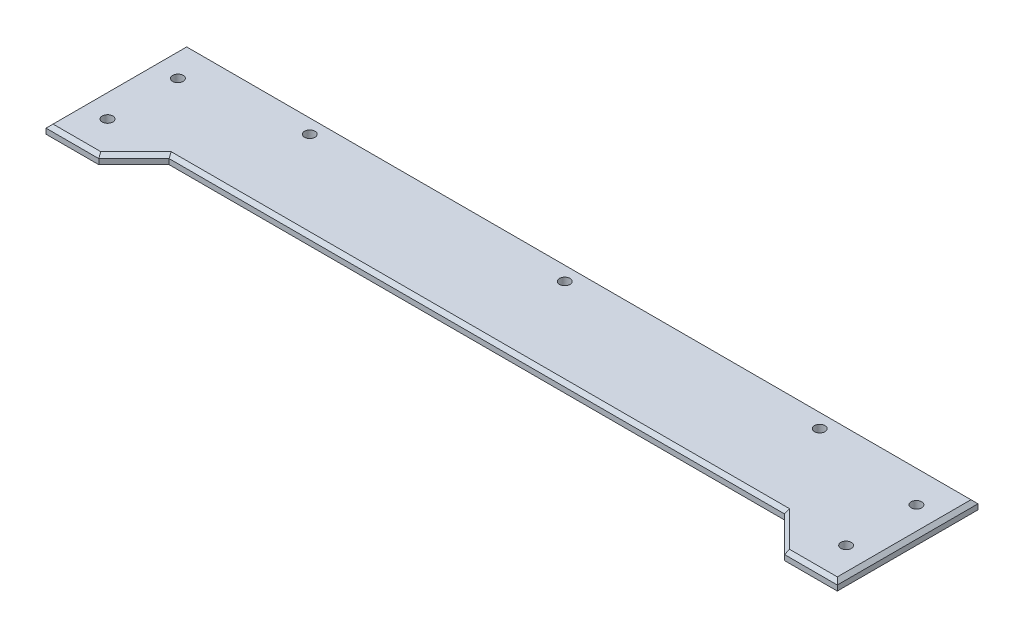
ISO-10303-21;
HEADER;
FILE_DESCRIPTION(('STEP AP214'),'2;1');
FILE_NAME('part.step','',(''),(''),'','','');
FILE_SCHEMA(('AUTOMOTIVE_DESIGN { 1 0 10303 214 1 1 1 1 }'));
ENDSEC;
DATA;
#1=APPLICATION_CONTEXT('core data for automotive mechanical design processes');
#2=APPLICATION_PROTOCOL_DEFINITION('international standard','automotive_design',2000,#1);
#3=PRODUCT_CONTEXT('',#1,'mechanical');
#4=PRODUCT('Part','Part','',(#3));
#5=PRODUCT_RELATED_PRODUCT_CATEGORY('part','',(#4));
#6=PRODUCT_DEFINITION_FORMATION('','',#4);
#7=PRODUCT_DEFINITION_CONTEXT('part definition',#1,'design');
#8=PRODUCT_DEFINITION('design','',#6,#7);
#9=PRODUCT_DEFINITION_SHAPE('','',#8);
#10=(LENGTH_UNIT() NAMED_UNIT(*) SI_UNIT(.MILLI.,.METRE.));
#11=(NAMED_UNIT(*) PLANE_ANGLE_UNIT() SI_UNIT($,.RADIAN.));
#12=(NAMED_UNIT(*) SI_UNIT($,.STERADIAN.) SOLID_ANGLE_UNIT());
#13=UNCERTAINTY_MEASURE_WITH_UNIT(LENGTH_MEASURE(1.E-05),#10,'distance_accuracy_value','');
#14=(GEOMETRIC_REPRESENTATION_CONTEXT(3) GLOBAL_UNCERTAINTY_ASSIGNED_CONTEXT((#13)) GLOBAL_UNIT_ASSIGNED_CONTEXT((#10,
#11,#12)) REPRESENTATION_CONTEXT('',''));
#15=CARTESIAN_POINT('',(0.,0.,0.));
#16=DIRECTION('',(0.,0.,1.));
#17=DIRECTION('',(1.,0.,0.));
#18=AXIS2_PLACEMENT_3D('',#15,#16,#17);
#19=CARTESIAN_POINT('',(0.,5.,0.));
#20=DIRECTION('',(0.,1.,0.));
#21=DIRECTION('',(0.,0.,1.));
#22=AXIS2_PLACEMENT_3D('',#19,#20,#21);
#23=PLANE('',#22);
#24=DIRECTION('',(1.,0.,0.));
#25=VECTOR('',#24,1.);
#26=CARTESIAN_POINT('',(-149.607843137255,5.,37.6078431372549));
#27=LINE('',#26,#25);
#28=CARTESIAN_POINT('',(-177.607843137255,5.,37.6078431372549));
#29=VERTEX_POINT('',#28);
#30=CARTESIAN_POINT('',(-150.436270262001,5.,37.6078431372549));
#31=VERTEX_POINT('',#30);
#32=EDGE_CURVE('E128',#29,#31,#27,.T.);
#33=ORIENTED_EDGE('',*,*,#32,.T.);
#34=DIRECTION('',(0.707106781186546,0.,-0.707106781186549));
#35=VECTOR('',#34,1.);
#36=CARTESIAN_POINT('',(-131.022056699628,5.,18.1936295748818));
#37=LINE('',#36,#35);
#38=CARTESIAN_POINT('',(-130.436270262001,5.,17.6078431372549));
#39=VERTEX_POINT('',#38);
#40=EDGE_CURVE('E191',#31,#39,#37,.T.);
#41=ORIENTED_EDGE('',*,*,#40,.T.);
#42=DIRECTION('',(1.,0.,0.));
#43=VECTOR('',#42,1.);
#44=CARTESIAN_POINT('',(220.392156862745,5.,17.6078431372549));
#45=LINE('',#44,#43);
#46=CARTESIAN_POINT('',(221.220583987491,5.,17.6078431372549));
#47=VERTEX_POINT('',#46);
#48=EDGE_CURVE('E189',#39,#47,#45,.T.);
#49=ORIENTED_EDGE('',*,*,#48,.T.);
#50=DIRECTION('',(0.707106781186546,0.,0.707106781186549));
#51=VECTOR('',#50,1.);
#52=CARTESIAN_POINT('',(241.806370425118,5.,38.1936295748818));
#53=LINE('',#52,#51);
#54=CARTESIAN_POINT('',(241.220583987491,5.,37.6078431372549));
#55=VERTEX_POINT('',#54);
#56=EDGE_CURVE('E187',#47,#55,#53,.T.);
#57=ORIENTED_EDGE('',*,*,#56,.T.);
#58=DIRECTION('',(1.,0.,0.));
#59=VECTOR('',#58,1.);
#60=CARTESIAN_POINT('',(270.392156862745,5.,37.6078431372549));
#61=LINE('',#60,#59);
#62=CARTESIAN_POINT('',(268.392156862745,5.,37.6078431372549));
#63=VERTEX_POINT('',#62);
#64=EDGE_CURVE('E185',#55,#63,#61,.T.);
#65=ORIENTED_EDGE('',*,*,#64,.T.);
#66=DIRECTION('',(0.,0.,-1.));
#67=VECTOR('',#66,1.);
#68=CARTESIAN_POINT('',(268.392156862745,5.,-40.3921568627451));
#69=LINE('',#68,#67);
#70=CARTESIAN_POINT('',(268.392156862745,5.,-38.3921568627451));
#71=VERTEX_POINT('',#70);
#72=EDGE_CURVE('E183',#63,#71,#69,.T.);
#73=ORIENTED_EDGE('',*,*,#72,.T.);
#74=DIRECTION('',(-1.,0.,0.));
#75=VECTOR('',#74,1.);
#76=CARTESIAN_POINT('',(-179.607843137255,5.,-38.3921568627451));
#77=LINE('',#76,#75);
#78=CARTESIAN_POINT('',(-177.607843137255,5.,-38.3921568627451));
#79=VERTEX_POINT('',#78);
#80=EDGE_CURVE('E181',#71,#79,#77,.T.);
#81=ORIENTED_EDGE('',*,*,#80,.T.);
#82=DIRECTION('',(0.,0.,1.));
#83=VECTOR('',#82,1.);
#84=CARTESIAN_POINT('',(-177.607843137255,5.,39.6078431372549));
#85=LINE('',#84,#83);
#86=EDGE_CURVE('E179',#79,#29,#85,.T.);
#87=ORIENTED_EDGE('',*,*,#86,.T.);
#88=EDGE_LOOP('',(#33,#41,#49,#57,#65,#73,#81,#87));
#89=FACE_BOUND('',#88,.T.);
#90=CARTESIAN_POINT('',(255.392156862745,5.,-20.3921568627451));
#91=DIRECTION('',(0.,1.,0.));
#92=DIRECTION('',(0.,0.,1.));
#93=AXIS2_PLACEMENT_3D('',#90,#91,#92);
#94=CIRCLE('',#93,2.99999999999999);
#95=CARTESIAN_POINT('',(255.392156862745,5.,-17.3921568627451));
#96=VERTEX_POINT('',#95);
#97=EDGE_CURVE('E244',#96,#96,#94,.T.);
#98=ORIENTED_EDGE('',*,*,#97,.F.);
#99=EDGE_LOOP('',(#98));
#100=FACE_BOUND('',#99,.T.);
#101=CARTESIAN_POINT('',(45.392156862745,5.,-30.3921568627451));
#102=DIRECTION('',(0.,1.,0.));
#103=DIRECTION('',(0.,0.,1.));
#104=AXIS2_PLACEMENT_3D('',#101,#102,#103);
#105=CIRCLE('',#104,3.);
#106=CARTESIAN_POINT('',(45.392156862745,5.,-27.3921568627451));
#107=VERTEX_POINT('',#106);
#108=EDGE_CURVE('E256',#107,#107,#105,.T.);
#109=ORIENTED_EDGE('',*,*,#108,.F.);
#110=EDGE_LOOP('',(#109));
#111=FACE_BOUND('',#110,.T.);
#112=CARTESIAN_POINT('',(-99.607843137255,5.,-30.3921568627451));
#113=DIRECTION('',(0.,1.,0.));
#114=DIRECTION('',(0.,0.,1.));
#115=AXIS2_PLACEMENT_3D('',#112,#113,#114);
#116=CIRCLE('',#115,3.00000000000001);
#117=CARTESIAN_POINT('',(-99.607843137255,5.,-27.3921568627451));
#118=VERTEX_POINT('',#117);
#119=EDGE_CURVE('E268',#118,#118,#116,.T.);
#120=ORIENTED_EDGE('',*,*,#119,.F.);
#121=EDGE_LOOP('',(#120));
#122=FACE_BOUND('',#121,.T.);
#123=CARTESIAN_POINT('',(-164.607843137255,5.,-20.3921568627451));
#124=DIRECTION('',(0.,1.,0.));
#125=DIRECTION('',(0.,0.,1.));
#126=AXIS2_PLACEMENT_3D('',#123,#124,#125);
#127=CIRCLE('',#126,2.99999999999999);
#128=CARTESIAN_POINT('',(-164.607843137255,5.,-17.3921568627451));
#129=VERTEX_POINT('',#128);
#130=EDGE_CURVE('E144',#129,#129,#127,.T.);
#131=ORIENTED_EDGE('',*,*,#130,.F.);
#132=EDGE_LOOP('',(#131));
#133=FACE_BOUND('',#132,.T.);
#134=CARTESIAN_POINT('',(190.392156862745,5.,-30.3921568627451));
#135=DIRECTION('',(0.,1.,0.));
#136=DIRECTION('',(0.,0.,1.));
#137=AXIS2_PLACEMENT_3D('',#134,#135,#136);
#138=CIRCLE('',#137,2.99999999999999);
#139=CARTESIAN_POINT('',(190.392156862745,5.,-27.3921568627451));
#140=VERTEX_POINT('',#139);
#141=EDGE_CURVE('E262',#140,#140,#138,.T.);
#142=ORIENTED_EDGE('',*,*,#141,.F.);
#143=EDGE_LOOP('',(#142));
#144=FACE_BOUND('',#143,.T.);
#145=CARTESIAN_POINT('',(-164.607843137255,5.,19.6078431372549));
#146=DIRECTION('',(0.,1.,0.));
#147=DIRECTION('',(0.,0.,1.));
#148=AXIS2_PLACEMENT_3D('',#145,#146,#147);
#149=CIRCLE('',#148,2.99999999999999);
#150=CARTESIAN_POINT('',(-164.607843137255,5.,22.6078431372549));
#151=VERTEX_POINT('',#150);
#152=EDGE_CURVE('E250',#151,#151,#149,.T.);
#153=ORIENTED_EDGE('',*,*,#152,.F.);
#154=EDGE_LOOP('',(#153));
#155=FACE_BOUND('',#154,.T.);
#156=CARTESIAN_POINT('',(255.392156862745,5.,19.6078431372549));
#157=DIRECTION('',(0.,1.,0.));
#158=DIRECTION('',(0.,0.,1.));
#159=AXIS2_PLACEMENT_3D('',#156,#157,#158);
#160=CIRCLE('',#159,2.99999999999999);
#161=CARTESIAN_POINT('',(255.392156862745,5.,22.6078431372549));
#162=VERTEX_POINT('',#161);
#163=EDGE_CURVE('E236',#162,#162,#160,.T.);
#164=ORIENTED_EDGE('',*,*,#163,.F.);
#165=EDGE_LOOP('',(#164));
#166=FACE_BOUND('',#165,.T.);
#167=ADVANCED_FACE('F35',(#89,#100,#111,#122,#133,#144,#155,#166),#23,.T.);
#168=CARTESIAN_POINT('',(0.,0.,0.));
#169=DIRECTION('',(0.,1.,0.));
#170=DIRECTION('',(0.,0.,1.));
#171=AXIS2_PLACEMENT_3D('',#168,#169,#170);
#172=PLANE('',#171);
#173=CARTESIAN_POINT('',(255.392156862745,0.,-20.3921568627451));
#174=DIRECTION('',(0.,1.,0.));
#175=DIRECTION('',(0.,0.,1.));
#176=AXIS2_PLACEMENT_3D('',#173,#174,#175);
#177=CIRCLE('',#176,2.99999999999999);
#178=CARTESIAN_POINT('',(255.392156862745,0.,-17.3921568627451));
#179=VERTEX_POINT('',#178);
#180=EDGE_CURVE('E241',#179,#179,#177,.T.);
#181=ORIENTED_EDGE('',*,*,#180,.T.);
#182=EDGE_LOOP('',(#181));
#183=FACE_BOUND('',#182,.T.);
#184=CARTESIAN_POINT('',(45.392156862745,0.,-30.3921568627451));
#185=DIRECTION('',(0.,1.,0.));
#186=DIRECTION('',(0.,0.,1.));
#187=AXIS2_PLACEMENT_3D('',#184,#185,#186);
#188=CIRCLE('',#187,3.);
#189=CARTESIAN_POINT('',(45.392156862745,0.,-27.3921568627451));
#190=VERTEX_POINT('',#189);
#191=EDGE_CURVE('E253',#190,#190,#188,.T.);
#192=ORIENTED_EDGE('',*,*,#191,.T.);
#193=EDGE_LOOP('',(#192));
#194=FACE_BOUND('',#193,.T.);
#195=CARTESIAN_POINT('',(-99.607843137255,0.,-30.3921568627451));
#196=DIRECTION('',(0.,1.,0.));
#197=DIRECTION('',(0.,0.,1.));
#198=AXIS2_PLACEMENT_3D('',#195,#196,#197);
#199=CIRCLE('',#198,3.00000000000001);
#200=CARTESIAN_POINT('',(-99.607843137255,0.,-27.3921568627451));
#201=VERTEX_POINT('',#200);
#202=EDGE_CURVE('E265',#201,#201,#199,.T.);
#203=ORIENTED_EDGE('',*,*,#202,.T.);
#204=EDGE_LOOP('',(#203));
#205=FACE_BOUND('',#204,.T.);
#206=DIRECTION('',(0.,0.,1.));
#207=VECTOR('',#206,1.);
#208=CARTESIAN_POINT('',(-179.607843137255,0.,-40.3921568627451));
#209=LINE('',#208,#207);
#210=CARTESIAN_POINT('',(-179.607843137255,0.,-40.3921568627451));
#211=VERTEX_POINT('',#210);
#212=CARTESIAN_POINT('',(-179.607843137255,0.,39.6078431372549));
#213=VERTEX_POINT('',#212);
#214=EDGE_CURVE('E136',#211,#213,#209,.T.);
#215=ORIENTED_EDGE('',*,*,#214,.F.);
#216=DIRECTION('',(-1.,0.,0.));
#217=VECTOR('',#216,1.);
#218=CARTESIAN_POINT('',(-179.607843137255,0.,-40.3921568627451));
#219=LINE('',#218,#217);
#220=CARTESIAN_POINT('',(270.392156862745,0.,-40.3921568627451));
#221=VERTEX_POINT('',#220);
#222=EDGE_CURVE('E164',#221,#211,#219,.T.);
#223=ORIENTED_EDGE('',*,*,#222,.F.);
#224=DIRECTION('',(0.,0.,-1.));
#225=VECTOR('',#224,1.);
#226=CARTESIAN_POINT('',(270.392156862745,0.,-40.3921568627451));
#227=LINE('',#226,#225);
#228=CARTESIAN_POINT('',(270.392156862745,0.,39.6078431372549));
#229=VERTEX_POINT('',#228);
#230=EDGE_CURVE('E161',#229,#221,#227,.T.);
#231=ORIENTED_EDGE('',*,*,#230,.F.);
#232=DIRECTION('',(1.,0.,0.));
#233=VECTOR('',#232,1.);
#234=CARTESIAN_POINT('',(240.392156862745,0.,39.6078431372549));
#235=LINE('',#234,#233);
#236=CARTESIAN_POINT('',(240.392156862745,0.,39.6078431372549));
#237=VERTEX_POINT('',#236);
#238=EDGE_CURVE('E158',#237,#229,#235,.T.);
#239=ORIENTED_EDGE('',*,*,#238,.F.);
#240=DIRECTION('',(0.707106781186546,0.,0.707106781186549));
#241=VECTOR('',#240,1.);
#242=CARTESIAN_POINT('',(220.392156862745,0.,19.6078431372549));
#243=LINE('',#242,#241);
#244=CARTESIAN_POINT('',(220.392156862745,0.,19.6078431372549));
#245=VERTEX_POINT('',#244);
#246=EDGE_CURVE('E155',#245,#237,#243,.T.);
#247=ORIENTED_EDGE('',*,*,#246,.F.);
#248=DIRECTION('',(1.,0.,0.));
#249=VECTOR('',#248,1.);
#250=CARTESIAN_POINT('',(-129.607843137255,0.,19.6078431372549));
#251=LINE('',#250,#249);
#252=CARTESIAN_POINT('',(-129.607843137255,0.,19.6078431372549));
#253=VERTEX_POINT('',#252);
#254=EDGE_CURVE('E152',#253,#245,#251,.T.);
#255=ORIENTED_EDGE('',*,*,#254,.F.);
#256=DIRECTION('',(0.707106781186546,0.,-0.707106781186549));
#257=VECTOR('',#256,1.);
#258=CARTESIAN_POINT('',(-149.607843137255,0.,39.6078431372549));
#259=LINE('',#258,#257);
#260=CARTESIAN_POINT('',(-149.607843137255,0.,39.6078431372549));
#261=VERTEX_POINT('',#260);
#262=EDGE_CURVE('E139',#261,#253,#259,.T.);
#263=ORIENTED_EDGE('',*,*,#262,.F.);
#264=DIRECTION('',(1.,0.,0.));
#265=VECTOR('',#264,1.);
#266=CARTESIAN_POINT('',(-179.607843137255,0.,39.6078431372549));
#267=LINE('',#266,#265);
#268=EDGE_CURVE('E125',#213,#261,#267,.T.);
#269=ORIENTED_EDGE('',*,*,#268,.F.);
#270=EDGE_LOOP('',(#215,#223,#231,#239,#247,#255,#263,#269));
#271=FACE_BOUND('',#270,.T.);
#272=CARTESIAN_POINT('',(-164.607843137255,0.,-20.3921568627451));
#273=DIRECTION('',(0.,1.,0.));
#274=DIRECTION('',(0.,0.,1.));
#275=AXIS2_PLACEMENT_3D('',#272,#273,#274);
#276=CIRCLE('',#275,2.99999999999999);
#277=CARTESIAN_POINT('',(-164.607843137255,0.,-17.3921568627451));
#278=VERTEX_POINT('',#277);
#279=EDGE_CURVE('E147',#278,#278,#276,.T.);
#280=ORIENTED_EDGE('',*,*,#279,.T.);
#281=EDGE_LOOP('',(#280));
#282=FACE_BOUND('',#281,.T.);
#283=CARTESIAN_POINT('',(190.392156862745,0.,-30.3921568627451));
#284=DIRECTION('',(0.,1.,0.));
#285=DIRECTION('',(0.,0.,1.));
#286=AXIS2_PLACEMENT_3D('',#283,#284,#285);
#287=CIRCLE('',#286,2.99999999999999);
#288=CARTESIAN_POINT('',(190.392156862745,0.,-27.3921568627451));
#289=VERTEX_POINT('',#288);
#290=EDGE_CURVE('E259',#289,#289,#287,.T.);
#291=ORIENTED_EDGE('',*,*,#290,.T.);
#292=EDGE_LOOP('',(#291));
#293=FACE_BOUND('',#292,.T.);
#294=CARTESIAN_POINT('',(-164.607843137255,0.,19.6078431372549));
#295=DIRECTION('',(0.,1.,0.));
#296=DIRECTION('',(0.,0.,1.));
#297=AXIS2_PLACEMENT_3D('',#294,#295,#296);
#298=CIRCLE('',#297,2.99999999999999);
#299=CARTESIAN_POINT('',(-164.607843137255,0.,22.6078431372549));
#300=VERTEX_POINT('',#299);
#301=EDGE_CURVE('E247',#300,#300,#298,.T.);
#302=ORIENTED_EDGE('',*,*,#301,.T.);
#303=EDGE_LOOP('',(#302));
#304=FACE_BOUND('',#303,.T.);
#305=CARTESIAN_POINT('',(255.392156862745,0.,19.6078431372549));
#306=DIRECTION('',(0.,1.,0.));
#307=DIRECTION('',(0.,0.,1.));
#308=AXIS2_PLACEMENT_3D('',#305,#306,#307);
#309=CIRCLE('',#308,2.99999999999999);
#310=CARTESIAN_POINT('',(255.392156862745,0.,22.6078431372549));
#311=VERTEX_POINT('',#310);
#312=EDGE_CURVE('E230',#311,#311,#309,.T.);
#313=ORIENTED_EDGE('',*,*,#312,.T.);
#314=EDGE_LOOP('',(#313));
#315=FACE_BOUND('',#314,.T.);
#316=ADVANCED_FACE('F133',(#183,#194,#205,#271,#282,#293,#304,#315),#172,.F.);
#317=CARTESIAN_POINT('',(-179.607843137255,5.,-40.3921568627451));
#318=DIRECTION('',(1.,0.,0.));
#319=DIRECTION('',(0.,0.,-1.));
#320=AXIS2_PLACEMENT_3D('',#317,#318,#319);
#321=PLANE('',#320);
#322=DIRECTION('',(0.,-1.,0.));
#323=VECTOR('',#322,1.);
#324=CARTESIAN_POINT('',(-179.607843137255,5.,39.6078431372549));
#325=LINE('',#324,#323);
#326=CARTESIAN_POINT('',(-179.607843137255,3.,39.6078431372549));
#327=VERTEX_POINT('',#326);
#328=EDGE_CURVE('E122',#327,#213,#325,.T.);
#329=ORIENTED_EDGE('',*,*,#328,.F.);
#330=DIRECTION('',(0.,0.,-1.));
#331=VECTOR('',#330,1.);
#332=CARTESIAN_POINT('',(-179.607843137255,3.,-40.3921568627451));
#333=LINE('',#332,#331);
#334=CARTESIAN_POINT('',(-179.607843137255,3.,-40.3921568627451));
#335=VERTEX_POINT('',#334);
#336=EDGE_CURVE('E44',#327,#335,#333,.T.);
#337=ORIENTED_EDGE('',*,*,#336,.T.);
#338=DIRECTION('',(0.,-1.,0.));
#339=VECTOR('',#338,1.);
#340=CARTESIAN_POINT('',(-179.607843137255,5.,-40.3921568627451));
#341=LINE('',#340,#339);
#342=EDGE_CURVE('E142',#335,#211,#341,.T.);
#343=ORIENTED_EDGE('',*,*,#342,.T.);
#344=ORIENTED_EDGE('',*,*,#214,.T.);
#345=EDGE_LOOP('',(#329,#337,#343,#344));
#346=FACE_BOUND('',#345,.T.);
#347=ADVANCED_FACE('F141',(#346),#321,.F.);
#348=CARTESIAN_POINT('',(-179.607843137255,5.,39.6078431372549));
#349=DIRECTION('',(0.,0.,-1.));
#350=DIRECTION('',(-1.,0.,0.));
#351=AXIS2_PLACEMENT_3D('',#348,#349,#350);
#352=PLANE('',#351);
#353=DIRECTION('',(0.,-1.,0.));
#354=VECTOR('',#353,1.);
#355=CARTESIAN_POINT('',(-149.607843137255,5.,39.6078431372549));
#356=LINE('',#355,#354);
#357=CARTESIAN_POINT('',(-149.607843137255,3.,39.6078431372549));
#358=VERTEX_POINT('',#357);
#359=EDGE_CURVE('E129',#358,#261,#356,.T.);
#360=ORIENTED_EDGE('',*,*,#359,.F.);
#361=DIRECTION('',(-1.,0.,0.));
#362=VECTOR('',#361,1.);
#363=CARTESIAN_POINT('',(-179.607843137255,3.,39.6078431372549));
#364=LINE('',#363,#362);
#365=EDGE_CURVE('E11',#358,#327,#364,.T.);
#366=ORIENTED_EDGE('',*,*,#365,.T.);
#367=ORIENTED_EDGE('',*,*,#328,.T.);
#368=ORIENTED_EDGE('',*,*,#268,.T.);
#369=EDGE_LOOP('',(#360,#366,#367,#368));
#370=FACE_BOUND('',#369,.T.);
#371=ADVANCED_FACE('F124',(#370),#352,.F.);
#372=CARTESIAN_POINT('',(-149.607843137255,5.,39.6078431372549));
#373=DIRECTION('',(-0.707106781186549,0.,-0.707106781186546));
#374=DIRECTION('',(-0.707106781186546,0.,0.707106781186549));
#375=AXIS2_PLACEMENT_3D('',#372,#373,#374);
#376=PLANE('',#375);
#377=DIRECTION('',(0.,-1.,0.));
#378=VECTOR('',#377,1.);
#379=CARTESIAN_POINT('',(-129.607843137255,5.,19.6078431372549));
#380=LINE('',#379,#378);
#381=CARTESIAN_POINT('',(-129.607843137255,3.,19.6078431372549));
#382=VERTEX_POINT('',#381);
#383=EDGE_CURVE('E175',#382,#253,#380,.T.);
#384=ORIENTED_EDGE('',*,*,#383,.F.);
#385=DIRECTION('',(-0.707106781186546,0.,0.707106781186549));
#386=VECTOR('',#385,1.);
#387=CARTESIAN_POINT('',(-149.607843137255,2.99999999999999,39.6078431372549));
#388=LINE('',#387,#386);
#389=EDGE_CURVE('E194',#382,#358,#388,.T.);
#390=ORIENTED_EDGE('',*,*,#389,.T.);
#391=ORIENTED_EDGE('',*,*,#359,.T.);
#392=ORIENTED_EDGE('',*,*,#262,.T.);
#393=EDGE_LOOP('',(#384,#390,#391,#392));
#394=FACE_BOUND('',#393,.T.);
#395=ADVANCED_FACE('F319',(#394),#376,.F.);
#396=CARTESIAN_POINT('',(-129.607843137255,5.,19.6078431372549));
#397=DIRECTION('',(0.,0.,-1.));
#398=DIRECTION('',(-1.,0.,0.));
#399=AXIS2_PLACEMENT_3D('',#396,#397,#398);
#400=PLANE('',#399);
#401=DIRECTION('',(0.,-1.,0.));
#402=VECTOR('',#401,1.);
#403=CARTESIAN_POINT('',(220.392156862745,5.,19.6078431372549));
#404=LINE('',#403,#402);
#405=CARTESIAN_POINT('',(220.392156862745,3.,19.6078431372549));
#406=VERTEX_POINT('',#405);
#407=EDGE_CURVE('E173',#406,#245,#404,.T.);
#408=ORIENTED_EDGE('',*,*,#407,.F.);
#409=DIRECTION('',(-1.,0.,0.));
#410=VECTOR('',#409,1.);
#411=CARTESIAN_POINT('',(-129.607843137255,3.,19.6078431372549));
#412=LINE('',#411,#410);
#413=EDGE_CURVE('E197',#406,#382,#412,.T.);
#414=ORIENTED_EDGE('',*,*,#413,.T.);
#415=ORIENTED_EDGE('',*,*,#383,.T.);
#416=ORIENTED_EDGE('',*,*,#254,.T.);
#417=EDGE_LOOP('',(#408,#414,#415,#416));
#418=FACE_BOUND('',#417,.T.);
#419=ADVANCED_FACE('F315',(#418),#400,.F.);
#420=CARTESIAN_POINT('',(220.392156862745,5.,19.6078431372549));
#421=DIRECTION('',(0.707106781186549,0.,-0.707106781186546));
#422=DIRECTION('',(-0.707106781186546,0.,-0.707106781186549));
#423=AXIS2_PLACEMENT_3D('',#420,#421,#422);
#424=PLANE('',#423);
#425=DIRECTION('',(0.,-1.,0.));
#426=VECTOR('',#425,1.);
#427=CARTESIAN_POINT('',(240.392156862745,5.,39.6078431372549));
#428=LINE('',#427,#426);
#429=CARTESIAN_POINT('',(240.392156862745,3.,39.6078431372549));
#430=VERTEX_POINT('',#429);
#431=EDGE_CURVE('E171',#430,#237,#428,.T.);
#432=ORIENTED_EDGE('',*,*,#431,.F.);
#433=DIRECTION('',(-0.707106781186546,0.,-0.707106781186549));
#434=VECTOR('',#433,1.);
#435=CARTESIAN_POINT('',(220.392156862745,3.,19.6078431372549));
#436=LINE('',#435,#434);
#437=EDGE_CURVE('E199',#430,#406,#436,.T.);
#438=ORIENTED_EDGE('',*,*,#437,.T.);
#439=ORIENTED_EDGE('',*,*,#407,.T.);
#440=ORIENTED_EDGE('',*,*,#246,.T.);
#441=EDGE_LOOP('',(#432,#438,#439,#440));
#442=FACE_BOUND('',#441,.T.);
#443=ADVANCED_FACE('F311',(#442),#424,.F.);
#444=CARTESIAN_POINT('',(240.392156862745,5.,39.6078431372549));
#445=DIRECTION('',(0.,0.,-1.));
#446=DIRECTION('',(-1.,0.,0.));
#447=AXIS2_PLACEMENT_3D('',#444,#445,#446);
#448=PLANE('',#447);
#449=DIRECTION('',(0.,-1.,0.));
#450=VECTOR('',#449,1.);
#451=CARTESIAN_POINT('',(270.392156862745,5.,39.6078431372549));
#452=LINE('',#451,#450);
#453=CARTESIAN_POINT('',(270.392156862745,3.,39.6078431372549));
#454=VERTEX_POINT('',#453);
#455=EDGE_CURVE('E169',#454,#229,#452,.T.);
#456=ORIENTED_EDGE('',*,*,#455,.F.);
#457=DIRECTION('',(-1.,0.,0.));
#458=VECTOR('',#457,1.);
#459=CARTESIAN_POINT('',(240.392156862745,3.,39.6078431372549));
#460=LINE('',#459,#458);
#461=EDGE_CURVE('E201',#454,#430,#460,.T.);
#462=ORIENTED_EDGE('',*,*,#461,.T.);
#463=ORIENTED_EDGE('',*,*,#431,.T.);
#464=ORIENTED_EDGE('',*,*,#238,.T.);
#465=EDGE_LOOP('',(#456,#462,#463,#464));
#466=FACE_BOUND('',#465,.T.);
#467=ADVANCED_FACE('F307',(#466),#448,.F.);
#468=CARTESIAN_POINT('',(270.392156862745,5.,-40.3921568627451));
#469=DIRECTION('',(-1.,0.,0.));
#470=DIRECTION('',(0.,0.,1.));
#471=AXIS2_PLACEMENT_3D('',#468,#469,#470);
#472=PLANE('',#471);
#473=DIRECTION('',(0.,-1.,0.));
#474=VECTOR('',#473,1.);
#475=CARTESIAN_POINT('',(270.392156862745,5.,-40.3921568627451));
#476=LINE('',#475,#474);
#477=CARTESIAN_POINT('',(270.392156862745,3.,-40.3921568627451));
#478=VERTEX_POINT('',#477);
#479=EDGE_CURVE('E167',#478,#221,#476,.T.);
#480=ORIENTED_EDGE('',*,*,#479,.F.);
#481=DIRECTION('',(0.,0.,1.));
#482=VECTOR('',#481,1.);
#483=CARTESIAN_POINT('',(270.392156862745,3.,39.6078431372549));
#484=LINE('',#483,#482);
#485=EDGE_CURVE('E203',#478,#454,#484,.T.);
#486=ORIENTED_EDGE('',*,*,#485,.T.);
#487=ORIENTED_EDGE('',*,*,#455,.T.);
#488=ORIENTED_EDGE('',*,*,#230,.T.);
#489=EDGE_LOOP('',(#480,#486,#487,#488));
#490=FACE_BOUND('',#489,.T.);
#491=ADVANCED_FACE('F303',(#490),#472,.F.);
#492=CARTESIAN_POINT('',(-179.607843137255,5.,-40.3921568627451));
#493=DIRECTION('',(0.,0.,1.));
#494=DIRECTION('',(1.,0.,0.));
#495=AXIS2_PLACEMENT_3D('',#492,#493,#494);
#496=PLANE('',#495);
#497=ORIENTED_EDGE('',*,*,#342,.F.);
#498=DIRECTION('',(1.,0.,0.));
#499=VECTOR('',#498,1.);
#500=CARTESIAN_POINT('',(270.392156862745,3.,-40.3921568627451));
#501=LINE('',#500,#499);
#502=EDGE_CURVE('E205',#335,#478,#501,.T.);
#503=ORIENTED_EDGE('',*,*,#502,.T.);
#504=ORIENTED_EDGE('',*,*,#479,.T.);
#505=ORIENTED_EDGE('',*,*,#222,.T.);
#506=EDGE_LOOP('',(#497,#503,#504,#505));
#507=FACE_BOUND('',#506,.T.);
#508=ADVANCED_FACE('F288',(#507),#496,.F.);
#509=CARTESIAN_POINT('',(-164.607843137255,5.,-20.3921568627451));
#510=DIRECTION('',(0.,-1.,0.));
#511=DIRECTION('',(0.,0.,-1.));
#512=AXIS2_PLACEMENT_3D('',#509,#510,#511);
#513=CYLINDRICAL_SURFACE('',#512,2.99999999999999);
#514=ORIENTED_EDGE('',*,*,#130,.T.);
#515=EDGE_LOOP('',(#514));
#516=FACE_BOUND('',#515,.T.);
#517=ORIENTED_EDGE('',*,*,#279,.F.);
#518=EDGE_LOOP('',(#517));
#519=FACE_BOUND('',#518,.T.);
#520=ADVANCED_FACE('F278',(#516,#519),#513,.F.);
#521=CARTESIAN_POINT('',(-99.607843137255,5.,-30.3921568627451));
#522=DIRECTION('',(0.,-1.,0.));
#523=DIRECTION('',(0.,0.,-1.));
#524=AXIS2_PLACEMENT_3D('',#521,#522,#523);
#525=CYLINDRICAL_SURFACE('',#524,3.00000000000001);
#526=ORIENTED_EDGE('',*,*,#119,.T.);
#527=EDGE_LOOP('',(#526));
#528=FACE_BOUND('',#527,.T.);
#529=ORIENTED_EDGE('',*,*,#202,.F.);
#530=EDGE_LOOP('',(#529));
#531=FACE_BOUND('',#530,.T.);
#532=ADVANCED_FACE('F275',(#528,#531),#525,.F.);
#533=CARTESIAN_POINT('',(190.392156862745,5.,-30.3921568627451));
#534=DIRECTION('',(0.,-1.,0.));
#535=DIRECTION('',(0.,0.,-1.));
#536=AXIS2_PLACEMENT_3D('',#533,#534,#535);
#537=CYLINDRICAL_SURFACE('',#536,2.99999999999999);
#538=ORIENTED_EDGE('',*,*,#141,.T.);
#539=EDGE_LOOP('',(#538));
#540=FACE_BOUND('',#539,.T.);
#541=ORIENTED_EDGE('',*,*,#290,.F.);
#542=EDGE_LOOP('',(#541));
#543=FACE_BOUND('',#542,.T.);
#544=ADVANCED_FACE('F277',(#540,#543),#537,.F.);
#545=CARTESIAN_POINT('',(45.392156862745,5.,-30.3921568627451));
#546=DIRECTION('',(0.,-1.,0.));
#547=DIRECTION('',(0.,0.,-1.));
#548=AXIS2_PLACEMENT_3D('',#545,#546,#547);
#549=CYLINDRICAL_SURFACE('',#548,3.);
#550=ORIENTED_EDGE('',*,*,#108,.T.);
#551=EDGE_LOOP('',(#550));
#552=FACE_BOUND('',#551,.T.);
#553=ORIENTED_EDGE('',*,*,#191,.F.);
#554=EDGE_LOOP('',(#553));
#555=FACE_BOUND('',#554,.T.);
#556=ADVANCED_FACE('F285',(#552,#555),#549,.F.);
#557=CARTESIAN_POINT('',(-164.607843137255,5.,19.6078431372549));
#558=DIRECTION('',(0.,-1.,0.));
#559=DIRECTION('',(0.,0.,-1.));
#560=AXIS2_PLACEMENT_3D('',#557,#558,#559);
#561=CYLINDRICAL_SURFACE('',#560,2.99999999999999);
#562=ORIENTED_EDGE('',*,*,#152,.T.);
#563=EDGE_LOOP('',(#562));
#564=FACE_BOUND('',#563,.T.);
#565=ORIENTED_EDGE('',*,*,#301,.F.);
#566=EDGE_LOOP('',(#565));
#567=FACE_BOUND('',#566,.T.);
#568=ADVANCED_FACE('F390',(#564,#567),#561,.F.);
#569=CARTESIAN_POINT('',(255.392156862745,5.,-20.3921568627451));
#570=DIRECTION('',(0.,-1.,0.));
#571=DIRECTION('',(0.,0.,-1.));
#572=AXIS2_PLACEMENT_3D('',#569,#570,#571);
#573=CYLINDRICAL_SURFACE('',#572,2.99999999999999);
#574=ORIENTED_EDGE('',*,*,#97,.T.);
#575=EDGE_LOOP('',(#574));
#576=FACE_BOUND('',#575,.T.);
#577=ORIENTED_EDGE('',*,*,#180,.F.);
#578=EDGE_LOOP('',(#577));
#579=FACE_BOUND('',#578,.T.);
#580=ADVANCED_FACE('F360',(#576,#579),#573,.F.);
#581=CARTESIAN_POINT('',(255.392156862745,5.,19.6078431372549));
#582=DIRECTION('',(0.,-1.,0.));
#583=DIRECTION('',(0.,0.,-1.));
#584=AXIS2_PLACEMENT_3D('',#581,#582,#583);
#585=CYLINDRICAL_SURFACE('',#584,2.99999999999999);
#586=ORIENTED_EDGE('',*,*,#163,.T.);
#587=EDGE_LOOP('',(#586));
#588=FACE_BOUND('',#587,.T.);
#589=ORIENTED_EDGE('',*,*,#312,.F.);
#590=EDGE_LOOP('',(#589));
#591=FACE_BOUND('',#590,.T.);
#592=ADVANCED_FACE('F355',(#588,#591),#585,.F.);
#593=CARTESIAN_POINT('',(268.392156862745,5.,0.));
#594=DIRECTION('',(0.707106781186547,0.707106781186547,0.));
#595=DIRECTION('',(0.,0.,1.));
#596=AXIS2_PLACEMENT_3D('',#593,#594,#595);
#597=PLANE('',#596);
#598=DIRECTION('',(0.577350269189626,-0.577350269189626,0.577350269189626));
#599=VECTOR('',#598,1.);
#600=CARTESIAN_POINT('',(255.856209150327,17.5359477124183,25.0718954248366));
#601=LINE('',#600,#599);
#602=EDGE_CURVE('E223',#454,#63,#601,.F.);
#603=ORIENTED_EDGE('',*,*,#602,.F.);
#604=ORIENTED_EDGE('',*,*,#485,.F.);
#605=DIRECTION('',(0.577350269189626,-0.577350269189626,-0.577350269189625));
#606=VECTOR('',#605,1.);
#607=CARTESIAN_POINT('',(178.928104575163,94.4640522875818,51.0718954248365));
#608=LINE('',#607,#606);
#609=EDGE_CURVE('E39',#71,#478,#608,.T.);
#610=ORIENTED_EDGE('',*,*,#609,.F.);
#611=ORIENTED_EDGE('',*,*,#72,.F.);
#612=EDGE_LOOP('',(#603,#604,#610,#611));
#613=FACE_BOUND('',#612,.T.);
#614=ADVANCED_FACE('F37',(#613),#597,.T.);
#615=CARTESIAN_POINT('',(0.,5.,-38.3921568627451));
#616=DIRECTION('',(0.,0.707106781186547,-0.707106781186548));
#617=DIRECTION('',(1.,0.,0.));
#618=AXIS2_PLACEMENT_3D('',#615,#616,#617);
#619=PLANE('',#618);
#620=ORIENTED_EDGE('',*,*,#609,.T.);
#621=ORIENTED_EDGE('',*,*,#502,.F.);
#622=DIRECTION('',(-0.577350269189626,-0.577350269189626,-0.577350269189625));
#623=VECTOR('',#622,1.);
#624=CARTESIAN_POINT('',(-164.81045751634,17.797385620915,-25.5947712418301));
#625=LINE('',#624,#623);
#626=EDGE_CURVE('E221',#79,#335,#625,.T.);
#627=ORIENTED_EDGE('',*,*,#626,.F.);
#628=ORIENTED_EDGE('',*,*,#80,.F.);
#629=EDGE_LOOP('',(#620,#621,#627,#628));
#630=FACE_BOUND('',#629,.T.);
#631=ADVANCED_FACE('F350',(#630),#619,.T.);
#632=CARTESIAN_POINT('',(0.,5.,37.6078431372549));
#633=DIRECTION('',(0.,0.707106781186547,0.707106781186547));
#634=DIRECTION('',(-1.,0.,0.));
#635=AXIS2_PLACEMENT_3D('',#632,#633,#634);
#636=PLANE('',#635);
#637=ORIENTED_EDGE('',*,*,#602,.T.);
#638=ORIENTED_EDGE('',*,*,#64,.F.);
#639=DIRECTION('',(-0.281084637714821,-0.678598344545847,0.678598344545847));
#640=VECTOR('',#639,1.);
#641=CARTESIAN_POINT('',(222.162089733505,-41.0112753063832,83.6191184436381));
#642=LINE('',#641,#640);
#643=EDGE_CURVE('E218',#430,#55,#642,.F.);
#644=ORIENTED_EDGE('',*,*,#643,.F.);
#645=ORIENTED_EDGE('',*,*,#461,.F.);
#646=EDGE_LOOP('',(#637,#638,#644,#645));
#647=FACE_BOUND('',#646,.T.);
#648=ADVANCED_FACE('F347',(#647),#636,.T.);
#649=CARTESIAN_POINT('',(-177.607843137255,5.,0.));
#650=DIRECTION('',(-0.707106781186547,0.707106781186547,0.));
#651=DIRECTION('',(0.,0.,-1.));
#652=AXIS2_PLACEMENT_3D('',#649,#650,#651);
#653=PLANE('',#652);
#654=ORIENTED_EDGE('',*,*,#626,.T.);
#655=ORIENTED_EDGE('',*,*,#336,.F.);
#656=DIRECTION('',(-0.577350269189626,-0.577350269189626,0.577350269189626));
#657=VECTOR('',#656,1.);
#658=CARTESIAN_POINT('',(-118.40522875817,64.202614379085,-21.5947712418301));
#659=LINE('',#658,#657);
#660=EDGE_CURVE('E215',#29,#327,#659,.T.);
#661=ORIENTED_EDGE('',*,*,#660,.F.);
#662=ORIENTED_EDGE('',*,*,#86,.F.);
#663=EDGE_LOOP('',(#654,#655,#661,#662));
#664=FACE_BOUND('',#663,.T.);
#665=ADVANCED_FACE('F343',(#664),#653,.T.);
#666=CARTESIAN_POINT('',(101.806370425119,5.,-101.806370425118));
#667=DIRECTION('',(-0.500000000000001,0.707106781186547,0.499999999999999));
#668=DIRECTION('',(-0.707106781186546,0.,-0.707106781186549));
#669=AXIS2_PLACEMENT_3D('',#666,#667,#668);
#670=PLANE('',#669);
#671=ORIENTED_EDGE('',*,*,#643,.T.);
#672=ORIENTED_EDGE('',*,*,#56,.F.);
#673=DIRECTION('',(-0.28108463771482,-0.678598344545847,0.678598344545848));
#674=VECTOR('',#673,1.);
#675=CARTESIAN_POINT('',(203.742261204691,-37.1964039097722,59.8042470470271));
#676=LINE('',#675,#674);
#677=EDGE_CURVE('E212',#406,#47,#676,.F.);
#678=ORIENTED_EDGE('',*,*,#677,.F.);
#679=ORIENTED_EDGE('',*,*,#437,.F.);
#680=EDGE_LOOP('',(#671,#672,#678,#679));
#681=FACE_BOUND('',#680,.T.);
#682=ADVANCED_FACE('F339',(#681),#670,.T.);
#683=CARTESIAN_POINT('',(0.,5.,37.6078431372549));
#684=DIRECTION('',(0.,0.707106781186547,0.707106781186547));
#685=DIRECTION('',(-1.,0.,0.));
#686=AXIS2_PLACEMENT_3D('',#683,#684,#685);
#687=PLANE('',#686);
#688=ORIENTED_EDGE('',*,*,#660,.T.);
#689=ORIENTED_EDGE('',*,*,#365,.F.);
#690=DIRECTION('',(-0.281084637714821,0.678598344545847,-0.678598344545847));
#691=VECTOR('',#690,1.);
#692=CARTESIAN_POINT('',(-138.550515137023,-23.694751221767,66.3025943590219));
#693=LINE('',#692,#691);
#694=EDGE_CURVE('E210',#31,#358,#693,.F.);
#695=ORIENTED_EDGE('',*,*,#694,.F.);
#696=ORIENTED_EDGE('',*,*,#32,.F.);
#697=EDGE_LOOP('',(#688,#689,#695,#696));
#698=FACE_BOUND('',#697,.T.);
#699=ADVANCED_FACE('F335',(#698),#687,.T.);
#700=CARTESIAN_POINT('',(0.,5.,17.6078431372549));
#701=DIRECTION('',(0.,0.707106781186548,0.707106781186547));
#702=DIRECTION('',(-1.,0.,0.));
#703=AXIS2_PLACEMENT_3D('',#700,#701,#702);
#704=PLANE('',#703);
#705=ORIENTED_EDGE('',*,*,#677,.T.);
#706=ORIENTED_EDGE('',*,*,#48,.F.);
#707=DIRECTION('',(0.28108463771482,-0.678598344545847,0.678598344545847));
#708=VECTOR('',#707,1.);
#709=CARTESIAN_POINT('',(-138.707124491326,24.9676084528474,-2.35976531559252));
#710=LINE('',#709,#708);
#711=EDGE_CURVE('E208',#382,#39,#710,.F.);
#712=ORIENTED_EDGE('',*,*,#711,.F.);
#713=ORIENTED_EDGE('',*,*,#413,.F.);
#714=EDGE_LOOP('',(#705,#706,#712,#713));
#715=FACE_BOUND('',#714,.T.);
#716=ADVANCED_FACE('F331',(#715),#704,.T.);
#717=CARTESIAN_POINT('',(-56.4142135623734,5.,-56.4142135623732));
#718=DIRECTION('',(0.500000000000001,0.707106781186547,0.499999999999999));
#719=DIRECTION('',(-0.707106781186546,0.,0.707106781186549));
#720=AXIS2_PLACEMENT_3D('',#717,#718,#719);
#721=PLANE('',#720);
#722=ORIENTED_EDGE('',*,*,#694,.T.);
#723=ORIENTED_EDGE('',*,*,#389,.F.);
#724=ORIENTED_EDGE('',*,*,#711,.T.);
#725=ORIENTED_EDGE('',*,*,#40,.F.);
#726=EDGE_LOOP('',(#722,#723,#724,#725));
#727=FACE_BOUND('',#726,.T.);
#728=ADVANCED_FACE('F328',(#727),#721,.T.);
#729=CLOSED_SHELL('',(#167,#316,#347,#371,#395,#419,#443,#467,#491,#508,#520,#532,#544,#556,
#568,#580,#592,#614,#631,#648,#665,#682,#699,#716,#728));
#730=MANIFOLD_SOLID_BREP('B2',#729);
#731=ADVANCED_BREP_SHAPE_REPRESENTATION('',(#18,#730),#14);
#732=SHAPE_DEFINITION_REPRESENTATION(#9,#731);
ENDSEC;
END-ISO-10303-21;
